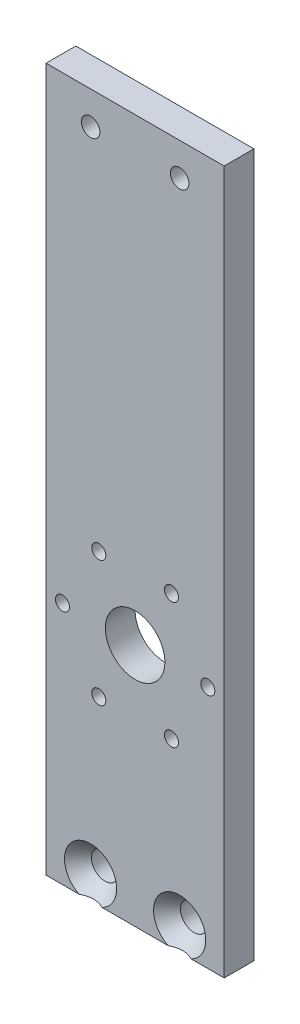
ISO-10303-21;
HEADER;
FILE_DESCRIPTION(('STEP AP214'),'2;1');
FILE_NAME('part.step','',(''),(''),'','','');
FILE_SCHEMA(('AUTOMOTIVE_DESIGN { 1 0 10303 214 1 1 1 1 }'));
ENDSEC;
DATA;
#1=APPLICATION_CONTEXT('core data for automotive mechanical design processes');
#2=APPLICATION_PROTOCOL_DEFINITION('international standard','automotive_design',2000,#1);
#3=PRODUCT_CONTEXT('',#1,'mechanical');
#4=PRODUCT('Part','Part','',(#3));
#5=PRODUCT_RELATED_PRODUCT_CATEGORY('part','',(#4));
#6=PRODUCT_DEFINITION_FORMATION('','',#4);
#7=PRODUCT_DEFINITION_CONTEXT('part definition',#1,'design');
#8=PRODUCT_DEFINITION('design','',#6,#7);
#9=PRODUCT_DEFINITION_SHAPE('','',#8);
#10=(LENGTH_UNIT() NAMED_UNIT(*) SI_UNIT(.MILLI.,.METRE.));
#11=(NAMED_UNIT(*) PLANE_ANGLE_UNIT() SI_UNIT($,.RADIAN.));
#12=(NAMED_UNIT(*) SI_UNIT($,.STERADIAN.) SOLID_ANGLE_UNIT());
#13=UNCERTAINTY_MEASURE_WITH_UNIT(LENGTH_MEASURE(1.E-05),#10,'distance_accuracy_value','');
#14=(GEOMETRIC_REPRESENTATION_CONTEXT(3) GLOBAL_UNCERTAINTY_ASSIGNED_CONTEXT((#13)) GLOBAL_UNIT_ASSIGNED_CONTEXT((#10,
#11,#12)) REPRESENTATION_CONTEXT('',''));
#15=CARTESIAN_POINT('',(0.,0.,0.));
#16=DIRECTION('',(0.,0.,1.));
#17=DIRECTION('',(1.,0.,0.));
#18=AXIS2_PLACEMENT_3D('',#15,#16,#17);
#19=CARTESIAN_POINT('',(0.,0.,3.175));
#20=DIRECTION('',(0.,0.,-1.));
#21=DIRECTION('',(-1.,0.,0.));
#22=AXIS2_PLACEMENT_3D('',#19,#20,#21);
#23=PLANE('',#22);
#24=CARTESIAN_POINT('',(-9.5,68.,3.175));
#25=DIRECTION('',(0.,0.,1.));
#26=DIRECTION('',(1.,0.,0.));
#27=AXIS2_PLACEMENT_3D('',#24,#25,#26);
#28=CIRCLE('',#27,1.984375);
#29=CARTESIAN_POINT('',(-7.515625,68.,3.175));
#30=VERTEX_POINT('',#29);
#31=EDGE_CURVE('E318',#30,#30,#28,.T.);
#32=ORIENTED_EDGE('',*,*,#31,.F.);
#33=EDGE_LOOP('',(#32));
#34=FACE_BOUND('',#33,.T.);
#35=CARTESIAN_POINT('',(-7.75000000000014,-36.4233937586587,3.175));
#36=DIRECTION('',(0.,0.,1.));
#37=DIRECTION('',(1.,0.,0.));
#38=AXIS2_PLACEMENT_3D('',#35,#36,#37);
#39=CIRCLE('',#38,1.5);
#40=CARTESIAN_POINT('',(-6.25000000000014,-36.4233937586587,3.175));
#41=VERTEX_POINT('',#40);
#42=EDGE_CURVE('E239',#41,#41,#39,.T.);
#43=ORIENTED_EDGE('',*,*,#42,.F.);
#44=EDGE_LOOP('',(#43));
#45=FACE_BOUND('',#44,.T.);
#46=CARTESIAN_POINT('',(7.74999999999989,-36.4233937586589,3.175));
#47=DIRECTION('',(0.,0.,1.));
#48=DIRECTION('',(1.,0.,0.));
#49=AXIS2_PLACEMENT_3D('',#46,#47,#48);
#50=CIRCLE('',#49,1.5);
#51=CARTESIAN_POINT('',(9.24999999999989,-36.4233937586589,3.175));
#52=VERTEX_POINT('',#51);
#53=EDGE_CURVE('E255',#52,#52,#50,.T.);
#54=ORIENTED_EDGE('',*,*,#53,.F.);
#55=EDGE_LOOP('',(#54));
#56=FACE_BOUND('',#55,.T.);
#57=CARTESIAN_POINT('',(15.5,-23.0000000000001,3.175));
#58=DIRECTION('',(0.,0.,1.));
#59=DIRECTION('',(1.,0.,0.));
#60=AXIS2_PLACEMENT_3D('',#57,#58,#59);
#61=CIRCLE('',#60,1.5);
#62=CARTESIAN_POINT('',(17.,-23.0000000000001,3.175));
#63=VERTEX_POINT('',#62);
#64=EDGE_CURVE('E252',#63,#63,#61,.T.);
#65=ORIENTED_EDGE('',*,*,#64,.F.);
#66=EDGE_LOOP('',(#65));
#67=FACE_BOUND('',#66,.T.);
#68=CARTESIAN_POINT('',(7.75000000000008,-9.57660624134124,3.175));
#69=DIRECTION('',(0.,0.,1.));
#70=DIRECTION('',(1.,0.,0.));
#71=AXIS2_PLACEMENT_3D('',#68,#69,#70);
#72=CIRCLE('',#71,1.5);
#73=CARTESIAN_POINT('',(9.25000000000008,-9.57660624134124,3.175));
#74=VERTEX_POINT('',#73);
#75=EDGE_CURVE('E249',#74,#74,#72,.T.);
#76=ORIENTED_EDGE('',*,*,#75,.F.);
#77=EDGE_LOOP('',(#76));
#78=FACE_BOUND('',#77,.T.);
#79=CARTESIAN_POINT('',(-7.74999999999995,-9.57660624134119,3.175));
#80=DIRECTION('',(0.,0.,1.));
#81=DIRECTION('',(1.,0.,0.));
#82=AXIS2_PLACEMENT_3D('',#79,#80,#81);
#83=CIRCLE('',#82,1.5);
#84=CARTESIAN_POINT('',(-6.24999999999995,-9.57660624134119,3.175));
#85=VERTEX_POINT('',#84);
#86=EDGE_CURVE('E246',#85,#85,#83,.T.);
#87=ORIENTED_EDGE('',*,*,#86,.F.);
#88=EDGE_LOOP('',(#87));
#89=FACE_BOUND('',#88,.T.);
#90=CARTESIAN_POINT('',(-15.5,-23.,3.175));
#91=DIRECTION('',(0.,0.,1.));
#92=DIRECTION('',(1.,0.,0.));
#93=AXIS2_PLACEMENT_3D('',#90,#91,#92);
#94=CIRCLE('',#93,1.5);
#95=CARTESIAN_POINT('',(-14.,-23.,3.175));
#96=VERTEX_POINT('',#95);
#97=EDGE_CURVE('E243',#96,#96,#94,.T.);
#98=ORIENTED_EDGE('',*,*,#97,.F.);
#99=EDGE_LOOP('',(#98));
#100=FACE_BOUND('',#99,.T.);
#101=CARTESIAN_POINT('',(0.,-23.,3.175));
#102=DIRECTION('',(0.,0.,1.));
#103=DIRECTION('',(1.,0.,0.));
#104=AXIS2_PLACEMENT_3D('',#101,#102,#103);
#105=CIRCLE('',#104,6.35);
#106=CARTESIAN_POINT('',(6.35000000000001,-23.,3.175));
#107=VERTEX_POINT('',#106);
#108=EDGE_CURVE('E128',#107,#107,#105,.T.);
#109=ORIENTED_EDGE('',*,*,#108,.F.);
#110=EDGE_LOOP('',(#109));
#111=FACE_BOUND('',#110,.T.);
#112=CARTESIAN_POINT('',(-9.49999999999998,-70.,3.175));
#113=DIRECTION('',(0.,0.,1.));
#114=DIRECTION('',(1.,0.,0.));
#115=AXIS2_PLACEMENT_3D('',#112,#113,#114);
#116=CIRCLE('',#115,5.5626);
#117=CARTESIAN_POINT('',(-7.06227180350228,-75.,3.175));
#118=VERTEX_POINT('',#117);
#119=CARTESIAN_POINT('',(-11.9377281964977,-75.,3.175));
#120=VERTEX_POINT('',#119);
#121=EDGE_CURVE('E48',#118,#120,#116,.T.);
#122=ORIENTED_EDGE('',*,*,#121,.F.);
#123=DIRECTION('',(1.,0.,0.));
#124=VECTOR('',#123,1.);
#125=CARTESIAN_POINT('',(-19.,-75.,3.175));
#126=LINE('',#125,#124);
#127=CARTESIAN_POINT('',(7.06227180350231,-75.,3.175));
#128=VERTEX_POINT('',#127);
#129=EDGE_CURVE('E54',#118,#128,#126,.T.);
#130=ORIENTED_EDGE('',*,*,#129,.T.);
#131=CARTESIAN_POINT('',(9.50000000000002,-70.,3.175));
#132=DIRECTION('',(0.,0.,1.));
#133=DIRECTION('',(1.,0.,0.));
#134=AXIS2_PLACEMENT_3D('',#131,#132,#133);
#135=CIRCLE('',#134,5.5626);
#136=CARTESIAN_POINT('',(11.9377281964977,-75.,3.175));
#137=VERTEX_POINT('',#136);
#138=EDGE_CURVE('E237',#137,#128,#135,.T.);
#139=ORIENTED_EDGE('',*,*,#138,.F.);
#140=CARTESIAN_POINT('',(19.,-75.,3.175));
#141=VERTEX_POINT('',#140);
#142=EDGE_CURVE('E95',#137,#141,#126,.T.);
#143=ORIENTED_EDGE('',*,*,#142,.T.);
#144=DIRECTION('',(0.,1.,0.));
#145=VECTOR('',#144,1.);
#146=CARTESIAN_POINT('',(19.,-75.,3.175));
#147=LINE('',#146,#145);
#148=CARTESIAN_POINT('',(19.,75.,3.175));
#149=VERTEX_POINT('',#148);
#150=EDGE_CURVE('E112',#141,#149,#147,.T.);
#151=ORIENTED_EDGE('',*,*,#150,.T.);
#152=DIRECTION('',(-1.,0.,0.));
#153=VECTOR('',#152,1.);
#154=CARTESIAN_POINT('',(-19.,75.,3.175));
#155=LINE('',#154,#153);
#156=CARTESIAN_POINT('',(-19.,75.,3.175));
#157=VERTEX_POINT('',#156);
#158=EDGE_CURVE('E263',#149,#157,#155,.T.);
#159=ORIENTED_EDGE('',*,*,#158,.T.);
#160=DIRECTION('',(0.,-1.,0.));
#161=VECTOR('',#160,1.);
#162=CARTESIAN_POINT('',(-19.,-75.,3.175));
#163=LINE('',#162,#161);
#164=CARTESIAN_POINT('',(-19.,-75.,3.175));
#165=VERTEX_POINT('',#164);
#166=EDGE_CURVE('E98',#157,#165,#163,.T.);
#167=ORIENTED_EDGE('',*,*,#166,.T.);
#168=EDGE_CURVE('E89',#165,#120,#126,.T.);
#169=ORIENTED_EDGE('',*,*,#168,.T.);
#170=EDGE_LOOP('',(#122,#130,#139,#143,#151,#159,#167,#169));
#171=FACE_BOUND('',#170,.T.);
#172=CARTESIAN_POINT('',(9.5,68.,3.175));
#173=DIRECTION('',(0.,0.,1.));
#174=DIRECTION('',(1.,0.,0.));
#175=AXIS2_PLACEMENT_3D('',#172,#173,#174);
#176=CIRCLE('',#175,1.984375);
#177=CARTESIAN_POINT('',(11.484375,68.,3.175));
#178=VERTEX_POINT('',#177);
#179=EDGE_CURVE('E316',#178,#178,#176,.F.);
#180=ORIENTED_EDGE('',*,*,#179,.T.);
#181=EDGE_LOOP('',(#180));
#182=FACE_BOUND('',#181,.T.);
#183=ADVANCED_FACE('F32',(#34,#45,#56,#67,#78,#89,#100,#111,#171,#182),#23,.F.);
#184=CARTESIAN_POINT('',(0.,0.,-3.175));
#185=DIRECTION('',(0.,0.,-1.));
#186=DIRECTION('',(-1.,0.,0.));
#187=AXIS2_PLACEMENT_3D('',#184,#185,#186);
#188=PLANE('',#187);
#189=DIRECTION('',(0.,1.,0.));
#190=VECTOR('',#189,1.);
#191=CARTESIAN_POINT('',(19.,-75.,-3.175));
#192=LINE('',#191,#190);
#193=CARTESIAN_POINT('',(19.,-75.,-3.175));
#194=VERTEX_POINT('',#193);
#195=CARTESIAN_POINT('',(19.,75.,-3.175));
#196=VERTEX_POINT('',#195);
#197=EDGE_CURVE('E102',#194,#196,#192,.T.);
#198=ORIENTED_EDGE('',*,*,#197,.F.);
#199=DIRECTION('',(1.,0.,0.));
#200=VECTOR('',#199,1.);
#201=CARTESIAN_POINT('',(-19.,-75.,-3.175));
#202=LINE('',#201,#200);
#203=CARTESIAN_POINT('',(-19.,-75.,-3.175));
#204=VERTEX_POINT('',#203);
#205=EDGE_CURVE('E110',#204,#194,#202,.T.);
#206=ORIENTED_EDGE('',*,*,#205,.F.);
#207=DIRECTION('',(0.,-1.,0.));
#208=VECTOR('',#207,1.);
#209=CARTESIAN_POINT('',(-19.,-75.,-3.175));
#210=LINE('',#209,#208);
#211=CARTESIAN_POINT('',(-19.,75.,-3.175));
#212=VERTEX_POINT('',#211);
#213=EDGE_CURVE('E108',#212,#204,#210,.T.);
#214=ORIENTED_EDGE('',*,*,#213,.F.);
#215=DIRECTION('',(-1.,0.,0.));
#216=VECTOR('',#215,1.);
#217=CARTESIAN_POINT('',(-19.,75.,-3.175));
#218=LINE('',#217,#216);
#219=EDGE_CURVE('E105',#196,#212,#218,.T.);
#220=ORIENTED_EDGE('',*,*,#219,.F.);
#221=EDGE_LOOP('',(#198,#206,#214,#220));
#222=FACE_BOUND('',#221,.T.);
#223=CARTESIAN_POINT('',(0.,-23.,-3.175));
#224=DIRECTION('',(0.,0.,-1.));
#225=DIRECTION('',(-1.,0.,0.));
#226=AXIS2_PLACEMENT_3D('',#223,#224,#225);
#227=CIRCLE('',#226,6.35);
#228=CARTESIAN_POINT('',(-6.34999999999999,-23.,-3.175));
#229=VERTEX_POINT('',#228);
#230=EDGE_CURVE('E124',#229,#229,#227,.T.);
#231=ORIENTED_EDGE('',*,*,#230,.F.);
#232=EDGE_LOOP('',(#231));
#233=FACE_BOUND('',#232,.T.);
#234=CARTESIAN_POINT('',(-15.5,-23.,-3.175));
#235=DIRECTION('',(0.,0.,-1.));
#236=DIRECTION('',(-1.,0.,0.));
#237=AXIS2_PLACEMENT_3D('',#234,#235,#236);
#238=CIRCLE('',#237,1.5);
#239=CARTESIAN_POINT('',(-17.,-23.,-3.175));
#240=VERTEX_POINT('',#239);
#241=EDGE_CURVE('E127',#240,#240,#238,.T.);
#242=ORIENTED_EDGE('',*,*,#241,.F.);
#243=EDGE_LOOP('',(#242));
#244=FACE_BOUND('',#243,.T.);
#245=CARTESIAN_POINT('',(-7.74999999999995,-9.57660624134119,-3.175));
#246=DIRECTION('',(0.,0.,-1.));
#247=DIRECTION('',(-1.,0.,0.));
#248=AXIS2_PLACEMENT_3D('',#245,#246,#247);
#249=CIRCLE('',#248,1.5);
#250=CARTESIAN_POINT('',(-9.24999999999996,-9.57660624134119,-3.175));
#251=VERTEX_POINT('',#250);
#252=EDGE_CURVE('E131',#251,#251,#249,.T.);
#253=ORIENTED_EDGE('',*,*,#252,.F.);
#254=EDGE_LOOP('',(#253));
#255=FACE_BOUND('',#254,.T.);
#256=CARTESIAN_POINT('',(7.75000000000008,-9.57660624134124,-3.175));
#257=DIRECTION('',(0.,0.,-1.));
#258=DIRECTION('',(-1.,0.,0.));
#259=AXIS2_PLACEMENT_3D('',#256,#257,#258);
#260=CIRCLE('',#259,1.5);
#261=CARTESIAN_POINT('',(6.25000000000008,-9.57660624134124,-3.175));
#262=VERTEX_POINT('',#261);
#263=EDGE_CURVE('E134',#262,#262,#260,.T.);
#264=ORIENTED_EDGE('',*,*,#263,.F.);
#265=EDGE_LOOP('',(#264));
#266=FACE_BOUND('',#265,.T.);
#267=CARTESIAN_POINT('',(15.5,-23.0000000000001,-3.175));
#268=DIRECTION('',(0.,0.,-1.));
#269=DIRECTION('',(-1.,0.,0.));
#270=AXIS2_PLACEMENT_3D('',#267,#268,#269);
#271=CIRCLE('',#270,1.5);
#272=CARTESIAN_POINT('',(14.,-23.0000000000001,-3.175));
#273=VERTEX_POINT('',#272);
#274=EDGE_CURVE('E137',#273,#273,#271,.T.);
#275=ORIENTED_EDGE('',*,*,#274,.F.);
#276=EDGE_LOOP('',(#275));
#277=FACE_BOUND('',#276,.T.);
#278=CARTESIAN_POINT('',(7.74999999999989,-36.4233937586589,-3.175));
#279=DIRECTION('',(0.,0.,-1.));
#280=DIRECTION('',(-1.,0.,0.));
#281=AXIS2_PLACEMENT_3D('',#278,#279,#280);
#282=CIRCLE('',#281,1.5);
#283=CARTESIAN_POINT('',(6.24999999999989,-36.4233937586589,-3.175));
#284=VERTEX_POINT('',#283);
#285=EDGE_CURVE('E140',#284,#284,#282,.T.);
#286=ORIENTED_EDGE('',*,*,#285,.F.);
#287=EDGE_LOOP('',(#286));
#288=FACE_BOUND('',#287,.T.);
#289=CARTESIAN_POINT('',(-7.75000000000014,-36.4233937586587,-3.175));
#290=DIRECTION('',(0.,0.,-1.));
#291=DIRECTION('',(-1.,0.,0.));
#292=AXIS2_PLACEMENT_3D('',#289,#290,#291);
#293=CIRCLE('',#292,1.5);
#294=CARTESIAN_POINT('',(-9.25000000000014,-36.4233937586587,-3.175));
#295=VERTEX_POINT('',#294);
#296=EDGE_CURVE('E106',#295,#295,#293,.T.);
#297=ORIENTED_EDGE('',*,*,#296,.F.);
#298=EDGE_LOOP('',(#297));
#299=FACE_BOUND('',#298,.T.);
#300=CARTESIAN_POINT('',(9.50000000000002,-70.,-3.175));
#301=DIRECTION('',(0.,0.,-1.));
#302=DIRECTION('',(-1.,0.,0.));
#303=AXIS2_PLACEMENT_3D('',#300,#301,#302);
#304=CIRCLE('',#303,2.8956);
#305=CARTESIAN_POINT('',(6.60440000000002,-70.,-3.175));
#306=VERTEX_POINT('',#305);
#307=EDGE_CURVE('E152',#306,#306,#304,.T.);
#308=ORIENTED_EDGE('',*,*,#307,.F.);
#309=EDGE_LOOP('',(#308));
#310=FACE_BOUND('',#309,.T.);
#311=CARTESIAN_POINT('',(-9.49999999999998,-70.,-3.175));
#312=DIRECTION('',(0.,0.,-1.));
#313=DIRECTION('',(-1.,0.,0.));
#314=AXIS2_PLACEMENT_3D('',#311,#312,#313);
#315=CIRCLE('',#314,2.8956);
#316=CARTESIAN_POINT('',(-12.3956,-70.,-3.175));
#317=VERTEX_POINT('',#316);
#318=EDGE_CURVE('E172',#317,#317,#315,.T.);
#319=ORIENTED_EDGE('',*,*,#318,.F.);
#320=EDGE_LOOP('',(#319));
#321=FACE_BOUND('',#320,.T.);
#322=CARTESIAN_POINT('',(-9.5,68.,-3.175));
#323=DIRECTION('',(0.,0.,-1.));
#324=DIRECTION('',(-1.,0.,0.));
#325=AXIS2_PLACEMENT_3D('',#322,#323,#324);
#326=CIRCLE('',#325,1.984375);
#327=CARTESIAN_POINT('',(-11.484375,68.,-3.175));
#328=VERTEX_POINT('',#327);
#329=EDGE_CURVE('E317',#328,#328,#326,.T.);
#330=ORIENTED_EDGE('',*,*,#329,.F.);
#331=EDGE_LOOP('',(#330));
#332=FACE_BOUND('',#331,.T.);
#333=CARTESIAN_POINT('',(9.5,68.,-3.175));
#334=DIRECTION('',(0.,0.,-1.));
#335=DIRECTION('',(-1.,0.,0.));
#336=AXIS2_PLACEMENT_3D('',#333,#334,#335);
#337=CIRCLE('',#336,1.984375);
#338=CARTESIAN_POINT('',(7.515625,68.,-3.175));
#339=VERTEX_POINT('',#338);
#340=EDGE_CURVE('E36',#339,#339,#337,.F.);
#341=ORIENTED_EDGE('',*,*,#340,.T.);
#342=EDGE_LOOP('',(#341));
#343=FACE_BOUND('',#342,.T.);
#344=ADVANCED_FACE('F163',(#222,#233,#244,#255,#266,#277,#288,#299,#310,#321,#332,#343),#188,.T.);
#345=CARTESIAN_POINT('',(19.,-75.,3.175));
#346=DIRECTION('',(-1.,0.,0.));
#347=DIRECTION('',(0.,0.,1.));
#348=AXIS2_PLACEMENT_3D('',#345,#346,#347);
#349=PLANE('',#348);
#350=ORIENTED_EDGE('',*,*,#197,.T.);
#351=DIRECTION('',(0.,0.,-1.));
#352=VECTOR('',#351,1.);
#353=CARTESIAN_POINT('',(19.,75.,3.175));
#354=LINE('',#353,#352);
#355=EDGE_CURVE('E121',#149,#196,#354,.T.);
#356=ORIENTED_EDGE('',*,*,#355,.F.);
#357=ORIENTED_EDGE('',*,*,#150,.F.);
#358=DIRECTION('',(0.,0.,-1.));
#359=VECTOR('',#358,1.);
#360=CARTESIAN_POINT('',(19.,-75.,3.175));
#361=LINE('',#360,#359);
#362=EDGE_CURVE('E97',#141,#194,#361,.T.);
#363=ORIENTED_EDGE('',*,*,#362,.T.);
#364=EDGE_LOOP('',(#350,#356,#357,#363));
#365=FACE_BOUND('',#364,.T.);
#366=ADVANCED_FACE('F34',(#365),#349,.F.);
#367=CARTESIAN_POINT('',(-19.,75.,3.175));
#368=DIRECTION('',(0.,-1.,0.));
#369=DIRECTION('',(0.,0.,-1.));
#370=AXIS2_PLACEMENT_3D('',#367,#368,#369);
#371=PLANE('',#370);
#372=ORIENTED_EDGE('',*,*,#219,.T.);
#373=DIRECTION('',(0.,0.,-1.));
#374=VECTOR('',#373,1.);
#375=CARTESIAN_POINT('',(-19.,75.,3.175));
#376=LINE('',#375,#374);
#377=EDGE_CURVE('E118',#157,#212,#376,.T.);
#378=ORIENTED_EDGE('',*,*,#377,.F.);
#379=ORIENTED_EDGE('',*,*,#158,.F.);
#380=ORIENTED_EDGE('',*,*,#355,.T.);
#381=EDGE_LOOP('',(#372,#378,#379,#380));
#382=FACE_BOUND('',#381,.T.);
#383=ADVANCED_FACE('F278',(#382),#371,.F.);
#384=CARTESIAN_POINT('',(-19.,-75.,3.175));
#385=DIRECTION('',(1.,0.,0.));
#386=DIRECTION('',(0.,0.,-1.));
#387=AXIS2_PLACEMENT_3D('',#384,#385,#386);
#388=PLANE('',#387);
#389=ORIENTED_EDGE('',*,*,#213,.T.);
#390=DIRECTION('',(0.,0.,-1.));
#391=VECTOR('',#390,1.);
#392=CARTESIAN_POINT('',(-19.,-75.,3.175));
#393=LINE('',#392,#391);
#394=EDGE_CURVE('E115',#165,#204,#393,.T.);
#395=ORIENTED_EDGE('',*,*,#394,.F.);
#396=ORIENTED_EDGE('',*,*,#166,.F.);
#397=ORIENTED_EDGE('',*,*,#377,.T.);
#398=EDGE_LOOP('',(#389,#395,#396,#397));
#399=FACE_BOUND('',#398,.T.);
#400=ADVANCED_FACE('F162',(#399),#388,.F.);
#401=CARTESIAN_POINT('',(-19.,-75.,3.175));
#402=DIRECTION('',(0.,1.,0.));
#403=DIRECTION('',(0.,0.,1.));
#404=AXIS2_PLACEMENT_3D('',#401,#402,#403);
#405=PLANE('',#404);
#406=ORIENTED_EDGE('',*,*,#129,.F.);
#407=CARTESIAN_POINT('',(-26.0196585722648,-75.,16.6310367893635));
#408=CARTESIAN_POINT('',(-25.6187917750997,-75.,16.1897063110865));
#409=CARTESIAN_POINT('',(-25.217290981288,-75.,15.7489489785061));
#410=CARTESIAN_POINT('',(-24.4125950547089,-75.,14.8689406966457));
#411=CARTESIAN_POINT('',(-24.0093998320183,-75.,14.429689829619));
#412=CARTESIAN_POINT('',(-23.1997718673474,-75.,13.5518445301664));
#413=CARTESIAN_POINT('',(-22.793333155462,-75.,13.1132555973765));
#414=CARTESIAN_POINT('',(-21.9777776712772,-75.,12.2386056376471));
#415=CARTESIAN_POINT('',(-21.5686610038983,-75.,11.8025445129169));
#416=CARTESIAN_POINT('',(-20.6980078436307,-75.,10.8820442263586));
#417=CARTESIAN_POINT('',(-20.2360273159944,-75.,10.3980236615251));
#418=CARTESIAN_POINT('',(-19.5383790904854,-75.,9.6764486566446));
#419=CARTESIAN_POINT('',(-19.3050334001411,-75.,9.43664945223078));
#420=CARTESIAN_POINT('',(-18.8364677872479,-75.,8.95889045340858));
#421=CARTESIAN_POINT('',(-18.6012478786037,-75.,8.72093064537981));
#422=CARTESIAN_POINT('',(-18.1289320043782,-75.,8.24767933023866));
#423=CARTESIAN_POINT('',(-17.8918398802972,-75.,8.01238399392632));
#424=CARTESIAN_POINT('',(-17.4148696309615,-75.,7.54463800648936));
#425=CARTESIAN_POINT('',(-17.1749915605182,-75.,7.31218729958305));
#426=CARTESIAN_POINT('',(-16.6918076696093,-75.,6.85097571033452));
#427=CARTESIAN_POINT('',(-16.4485026093336,-75.,6.62221403309291));
#428=CARTESIAN_POINT('',(-15.9575039079211,-75.,6.16946028542685));
#429=CARTESIAN_POINT('',(-15.7098105695023,-75.,5.9454678883307));
#430=CARTESIAN_POINT('',(-15.3018311604176,-75.,5.58593898172003));
#431=CARTESIAN_POINT('',(-15.1432607305823,-75.,5.44845700420455));
#432=CARTESIAN_POINT('',(-14.8234552448771,-75.,5.17660816092634));
#433=CARTESIAN_POINT('',(-14.6622201012966,-75.,5.04224139805395));
#434=CARTESIAN_POINT('',(-14.3362753857389,-75.,4.77712225256447));
#435=CARTESIAN_POINT('',(-14.1715596838667,-75.,4.64637738221847));
#436=CARTESIAN_POINT('',(-13.838346955584,-75.,4.38979410981921));
#437=CARTESIAN_POINT('',(-13.6698501305131,-75.,4.26395544748912));
#438=CARTESIAN_POINT('',(-13.3316421942389,-75.,4.02094180935433));
#439=CARTESIAN_POINT('',(-13.1620184134616,-75.,3.90364594458456));
#440=CARTESIAN_POINT('',(-12.8175353577679,-75.,3.67683639229568));
#441=CARTESIAN_POINT('',(-12.6426746396574,-75.,3.56732487856276));
#442=CARTESIAN_POINT('',(-12.2874451466327,-75.,3.35890055845882));
#443=CARTESIAN_POINT('',(-12.1070957680074,-75.,3.25995498759554));
#444=CARTESIAN_POINT('',(-11.739658212254,-75.,3.0756096518651));
#445=CARTESIAN_POINT('',(-11.5525758328782,-75.,2.99019855951438));
#446=CARTESIAN_POINT('',(-11.2351667530232,-75.,2.86278099285603));
#447=CARTESIAN_POINT('',(-11.1068326989442,-75.,2.81582134393902));
#448=CARTESIAN_POINT('',(-10.8470918900173,-75.,2.73117575789262));
#449=CARTESIAN_POINT('',(-10.71568488291,-75.,2.69349058505419));
#450=CARTESIAN_POINT('',(-10.4507859634935,-75.,2.62898750889812));
#451=CARTESIAN_POINT('',(-10.3173051970033,-75.,2.60212439247495));
#452=CARTESIAN_POINT('',(-10.0484997821762,-75.,2.56028150487514));
#453=CARTESIAN_POINT('',(-9.91317554320713,-75.,2.54529913780205));
#454=CARTESIAN_POINT('',(-9.63237027191908,-75.,2.52740743647533));
#455=CARTESIAN_POINT('',(-9.48683012906343,-75.,2.5253981859898));
#456=CARTESIAN_POINT('',(-9.19629021851148,-75.,2.53598141373028));
#457=CARTESIAN_POINT('',(-9.05129046879455,-75.,2.54857437350968));
#458=CARTESIAN_POINT('',(-8.76262236016367,-75.,2.58766554224584));
#459=CARTESIAN_POINT('',(-8.61896153384905,-75.,2.61421854312751));
#460=CARTESIAN_POINT('',(-8.33453692190763,-75.,2.67981294890654));
#461=CARTESIAN_POINT('',(-8.1937738202087,-75.,2.71885726686712));
#462=CARTESIAN_POINT('',(-7.85752415461905,-75.,2.82626652345148));
#463=CARTESIAN_POINT('',(-7.66377942328898,-75.,2.90006436191173));
#464=CARTESIAN_POINT('',(-7.28353814959474,-75.,3.06433932931765));
#465=CARTESIAN_POINT('',(-7.09704614036378,-75.,3.15482669302913));
#466=CARTESIAN_POINT('',(-6.72897282247384,-75.,3.34934783337401));
#467=CARTESIAN_POINT('',(-6.5474582978447,-75.,3.45350670049429));
#468=CARTESIAN_POINT('',(-6.27971844819698,-75.,3.61697995540621));
#469=CARTESIAN_POINT('',(-6.19123996956942,-75.,3.67266805107579));
#470=CARTESIAN_POINT('',(-6.01565843486318,-75.,3.78616684552813));
#471=CARTESIAN_POINT('',(-5.9285553223738,-75.,3.84397745693073));
#472=CARTESIAN_POINT('',(-5.64383351518841,-75.,4.03736056377651));
#473=CARTESIAN_POINT('',(-5.44888218911779,-75.,4.1768655980156));
#474=CARTESIAN_POINT('',(-5.0643417801212,-75.,4.46310852614649));
#475=CARTESIAN_POINT('',(-4.87475409591164,-75.,4.60984827981993));
#476=CARTESIAN_POINT('',(-4.49981055899002,-75.,4.90896306335746));
#477=CARTESIAN_POINT('',(-4.31445871521441,-75.,5.06134310094799));
#478=CARTESIAN_POINT('',(-3.94738695866079,-75.,5.37036628027693));
#479=CARTESIAN_POINT('',(-3.76566671495779,-75.,5.52700903048056));
#480=CARTESIAN_POINT('',(-3.40445251858069,-75.,5.84434099727339));
#481=CARTESIAN_POINT('',(-3.22497105757801,-75.,6.00504439897362));
#482=CARTESIAN_POINT('',(-2.86850829244934,-75.,6.32920078248979));
#483=CARTESIAN_POINT('',(-2.69152703636554,-75.,6.49265381700888));
#484=CARTESIAN_POINT('',(-2.16388709454752,-75.,6.98617941955953));
#485=CARTESIAN_POINT('',(-1.81634588035704,-75.,7.31958416308448));
#486=CARTESIAN_POINT('',(-1.16302339541538,-75.,7.95756174474148));
#487=CARTESIAN_POINT('',(-0.85665238247317,-75.,8.26153458299604));
#488=CARTESIAN_POINT('',(-0.24756040130192,-75.,8.87319729292583));
#489=CARTESIAN_POINT('',(0.0551600489251962,-75.,9.18088767999106));
#490=CARTESIAN_POINT('',(0.655130939901568,-75.,9.79640250525315));
#491=CARTESIAN_POINT('',(0.952406036843112,-75.,10.1042029644136));
#492=CARTESIAN_POINT('',(1.54461692816667,-75.,10.7219319446204));
#493=CARTESIAN_POINT('',(1.83955316868381,-75.,11.0318600377012));
#494=CARTESIAN_POINT('',(2.13362121559879,-75.,11.342602237988));
#495=B_SPLINE_CURVE_WITH_KNOTS('',3,(#407,#408,#409,#410,#411,#412,#413,#414,#415,#416,#417,
#418,#419,#420,#421,#422,#423,#424,#425,#426,#427,#428,#429,#430,#431,#432,#433,#434,#435,#436,
#437,#438,#439,#440,#441,#442,#443,#444,#445,#446,#447,#448,#449,#450,#451,#452,#453,#454,#455,
#456,#457,#458,#459,#460,#461,#462,#463,#464,#465,#466,#467,#468,#469,#470,#471,#472,#473,#474,
#475,#476,#477,#478,#479,#480,#481,#482,#483,#484,#485,#486,#487,#488,#489,#490,#491,#492,#493,
#494),.UNSPECIFIED.,.F.,.F.,(4,2,2,2,2,2,2,2,2,2,2,2,2,2,2,2,2,2,2,2,2,2,2,2,2,2,2,2,2,2,2,2,2,
2,2,2,2,2,2,2,2,2,2,4),(0.,1.78863338006737,3.57736291257507,5.37122474954505,7.16501671985619,
9.17228682803492,10.176064222976,11.1798341779944,12.1819080803352,13.1839623009381,
14.1857976367994,15.1875641297875,15.8171461133098,16.4467488613388,17.0775722273511,
17.7083620822005,18.3268855274227,18.9455810227221,19.5622985659562,20.1784971988411,
20.5881751887829,20.9978869281702,21.4058687386587,21.8137613821639,22.2496749307726,
22.6856028553981,23.1232546742623,23.5610086311057,24.1818934584528,24.8031603139062,
25.4305697664779,25.7441812746443,26.0577798864346,26.776699533139,27.4958049612831,
28.2155649281198,28.9352590058917,29.657963457968,30.3806817781848,31.8253706083484,
33.12008277183,34.4149765383814,35.6987176657559,36.9822077273845),.UNSPECIFIED.);
#496=EDGE_CURVE('E11',#118,#120,#495,.F.);
#497=ORIENTED_EDGE('',*,*,#496,.T.);
#498=ORIENTED_EDGE('',*,*,#168,.F.);
#499=ORIENTED_EDGE('',*,*,#394,.T.);
#500=ORIENTED_EDGE('',*,*,#205,.T.);
#501=ORIENTED_EDGE('',*,*,#362,.F.);
#502=ORIENTED_EDGE('',*,*,#142,.F.);
#503=CARTESIAN_POINT('',(-7.01965857226476,-75.,16.6310367893635));
#504=CARTESIAN_POINT('',(-6.61879177509973,-75.,16.1897063110865));
#505=CARTESIAN_POINT('',(-6.21729098128802,-75.,15.7489489785061));
#506=CARTESIAN_POINT('',(-5.41259505470886,-75.,14.8689406966457));
#507=CARTESIAN_POINT('',(-5.00939983201829,-75.,14.429689829619));
#508=CARTESIAN_POINT('',(-4.19977186734739,-75.,13.5518445301664));
#509=CARTESIAN_POINT('',(-3.79333315546204,-75.,13.1132555973765));
#510=CARTESIAN_POINT('',(-2.97777767127718,-75.,12.2386056376471));
#511=CARTESIAN_POINT('',(-2.56866100389831,-75.,11.8025445129169));
#512=CARTESIAN_POINT('',(-1.69800784363066,-75.,10.8820442263586));
#513=CARTESIAN_POINT('',(-1.23602731599445,-75.,10.3980236615251));
#514=CARTESIAN_POINT('',(-0.538379090485443,-75.,9.67644865664461));
#515=CARTESIAN_POINT('',(-0.305033400141069,-75.,9.43664945223079));
#516=CARTESIAN_POINT('',(0.163532212752065,-75.,8.95889045340859));
#517=CARTESIAN_POINT('',(0.398752121396337,-75.,8.72093064537981));
#518=CARTESIAN_POINT('',(0.871067995621756,-75.,8.24767933023867));
#519=CARTESIAN_POINT('',(1.10816011970275,-75.,8.01238399392633));
#520=CARTESIAN_POINT('',(1.58513036903845,-75.,7.54463800648937));
#521=CARTESIAN_POINT('',(1.82500843948183,-75.,7.31218729958306));
#522=CARTESIAN_POINT('',(2.30819233039065,-75.,6.85097571033453));
#523=CARTESIAN_POINT('',(2.55149739066639,-75.,6.62221403309292));
#524=CARTESIAN_POINT('',(3.04249609207888,-75.,6.16946028542686));
#525=CARTESIAN_POINT('',(3.29018943049772,-75.,5.94546788833071));
#526=CARTESIAN_POINT('',(3.6981688395824,-75.,5.58593898172004));
#527=CARTESIAN_POINT('',(3.85673926941772,-75.,5.44845700420456));
#528=CARTESIAN_POINT('',(4.17654475512289,-75.,5.17660816092635));
#529=CARTESIAN_POINT('',(4.33777989870339,-75.,5.04224139805396));
#530=CARTESIAN_POINT('',(4.66372461426106,-75.,4.77712225256448));
#531=CARTESIAN_POINT('',(4.82844031613326,-75.,4.64637738221848));
#532=CARTESIAN_POINT('',(5.16165304441603,-75.,4.38979410981921));
#533=CARTESIAN_POINT('',(5.33014986948686,-75.,4.26395544748912));
#534=CARTESIAN_POINT('',(5.66835780576113,-75.,4.02094180935433));
#535=CARTESIAN_POINT('',(5.83798158653836,-75.,3.90364594458457));
#536=CARTESIAN_POINT('',(6.18246464223206,-75.,3.67683639229568));
#537=CARTESIAN_POINT('',(6.35732536034255,-75.,3.56732487856276));
#538=CARTESIAN_POINT('',(6.71255485336727,-75.,3.35890055845882));
#539=CARTESIAN_POINT('',(6.89290423199261,-75.,3.25995498759554));
#540=CARTESIAN_POINT('',(7.26034178774598,-75.,3.0756096518651));
#541=CARTESIAN_POINT('',(7.44742416712184,-75.,2.99019855951438));
#542=CARTESIAN_POINT('',(7.76483324697683,-75.,2.86278099285602));
#543=CARTESIAN_POINT('',(7.89316730105581,-75.,2.81582134393902));
#544=CARTESIAN_POINT('',(8.15290810998268,-75.,2.73117575789262));
#545=CARTESIAN_POINT('',(8.28431511709002,-75.,2.69349058505419));
#546=CARTESIAN_POINT('',(8.54921403650647,-75.,2.62898750889812));
#547=CARTESIAN_POINT('',(8.68269480299668,-75.,2.60212439247495));
#548=CARTESIAN_POINT('',(8.95150021782383,-75.,2.56028150487514));
#549=CARTESIAN_POINT('',(9.08682445679287,-75.,2.54529913780205));
#550=CARTESIAN_POINT('',(9.36762972808092,-75.,2.52740743647533));
#551=CARTESIAN_POINT('',(9.51316987093657,-75.,2.5253981859898));
#552=CARTESIAN_POINT('',(9.80370978148851,-75.,2.53598141373028));
#553=CARTESIAN_POINT('',(9.94870953120545,-75.,2.54857437350968));
#554=CARTESIAN_POINT('',(10.2373776398363,-75.,2.58766554224584));
#555=CARTESIAN_POINT('',(10.3810384661509,-75.,2.61421854312751));
#556=CARTESIAN_POINT('',(10.6654630780924,-75.,2.67981294890654));
#557=CARTESIAN_POINT('',(10.8062261797913,-75.,2.71885726686712));
#558=CARTESIAN_POINT('',(11.1424758453809,-75.,2.82626652345148));
#559=CARTESIAN_POINT('',(11.336220576711,-75.,2.90006436191173));
#560=CARTESIAN_POINT('',(11.7164618504053,-75.,3.06433932931765));
#561=CARTESIAN_POINT('',(11.9029538596362,-75.,3.15482669302913));
#562=CARTESIAN_POINT('',(12.2710271775262,-75.,3.34934783337401));
#563=CARTESIAN_POINT('',(12.4525417021553,-75.,3.45350670049429));
#564=CARTESIAN_POINT('',(12.720281551803,-75.,3.61697995540621));
#565=CARTESIAN_POINT('',(12.8087600304306,-75.,3.67266805107579));
#566=CARTESIAN_POINT('',(12.9843415651368,-75.,3.78616684552813));
#567=CARTESIAN_POINT('',(13.0714446776262,-75.,3.84397745693073));
#568=CARTESIAN_POINT('',(13.3561664848116,-75.,4.03736056377652));
#569=CARTESIAN_POINT('',(13.5511178108822,-75.,4.1768655980156));
#570=CARTESIAN_POINT('',(13.9356582198788,-75.,4.46310852614649));
#571=CARTESIAN_POINT('',(14.1252459040884,-75.,4.60984827981994));
#572=CARTESIAN_POINT('',(14.50018944101,-75.,4.90896306335746));
#573=CARTESIAN_POINT('',(14.6855412847856,-75.,5.06134310094799));
#574=CARTESIAN_POINT('',(15.0526130413392,-75.,5.37036628027693));
#575=CARTESIAN_POINT('',(15.2343332850422,-75.,5.52700903048056));
#576=CARTESIAN_POINT('',(15.5955474814193,-75.,5.84434099727339));
#577=CARTESIAN_POINT('',(15.775028942422,-75.,6.00504439897362));
#578=CARTESIAN_POINT('',(16.1314917075507,-75.,6.32920078248979));
#579=CARTESIAN_POINT('',(16.3084729636345,-75.,6.49265381700888));
#580=CARTESIAN_POINT('',(16.8361129054525,-75.,6.98617941955953));
#581=CARTESIAN_POINT('',(17.183654119643,-75.,7.31958416308448));
#582=CARTESIAN_POINT('',(17.8369766045846,-75.,7.95756174474148));
#583=CARTESIAN_POINT('',(18.1433476175268,-75.,8.26153458299604));
#584=CARTESIAN_POINT('',(18.7524395986981,-75.,8.87319729292583));
#585=CARTESIAN_POINT('',(19.0551600489252,-75.,9.18088767999106));
#586=CARTESIAN_POINT('',(19.6551309399016,-75.,9.79640250525315));
#587=CARTESIAN_POINT('',(19.9524060368431,-75.,10.1042029644136));
#588=CARTESIAN_POINT('',(20.5446169281667,-75.,10.7219319446204));
#589=CARTESIAN_POINT('',(20.8395531686838,-75.,11.0318600377012));
#590=CARTESIAN_POINT('',(21.1336212155988,-75.,11.342602237988));
#591=B_SPLINE_CURVE_WITH_KNOTS('',3,(#503,#504,#505,#506,#507,#508,#509,#510,#511,#512,#513,
#514,#515,#516,#517,#518,#519,#520,#521,#522,#523,#524,#525,#526,#527,#528,#529,#530,#531,#532,
#533,#534,#535,#536,#537,#538,#539,#540,#541,#542,#543,#544,#545,#546,#547,#548,#549,#550,#551,
#552,#553,#554,#555,#556,#557,#558,#559,#560,#561,#562,#563,#564,#565,#566,#567,#568,#569,#570,
#571,#572,#573,#574,#575,#576,#577,#578,#579,#580,#581,#582,#583,#584,#585,#586,#587,#588,#589,
#590),.UNSPECIFIED.,.F.,.F.,(4,2,2,2,2,2,2,2,2,2,2,2,2,2,2,2,2,2,2,2,2,2,2,2,2,2,2,2,2,2,2,2,2,
2,2,2,2,2,2,2,2,2,2,4),(0.,1.78863338006737,3.57736291257507,5.37122474954504,7.16501671985619,
9.1722868280349,10.176064222976,11.1798341779943,12.1819080803352,13.1839623009381,
14.1857976367993,15.1875641297875,15.8171461133098,16.4467488613388,17.0775722273511,
17.7083620822004,18.3268855274227,18.9455810227221,19.5622985659562,20.1784971988411,
20.5881751887829,20.9978869281702,21.4058687386587,21.8137613821639,22.2496749307726,
22.6856028553981,23.1232546742623,23.5610086311057,24.1818934584528,24.8031603139062,
25.4305697664778,25.7441812746443,26.0577798864346,26.7766995331389,27.4958049612831,
28.2155649281198,28.9352590058917,29.657963457968,30.3806817781848,31.8253706083484,
33.12008277183,34.4149765383814,35.6987176657559,36.9822077273845),.UNSPECIFIED.);
#592=EDGE_CURVE('E41',#137,#128,#591,.F.);
#593=ORIENTED_EDGE('',*,*,#592,.T.);
#594=EDGE_LOOP('',(#406,#497,#498,#499,#500,#501,#502,#593));
#595=FACE_BOUND('',#594,.T.);
#596=ADVANCED_FACE('F93',(#595),#405,.F.);
#597=CARTESIAN_POINT('',(0.,-23.,-22.225));
#598=DIRECTION('',(0.,0.,1.));
#599=DIRECTION('',(1.,0.,0.));
#600=AXIS2_PLACEMENT_3D('',#597,#598,#599);
#601=CYLINDRICAL_SURFACE('',#600,6.35);
#602=ORIENTED_EDGE('',*,*,#230,.T.);
#603=EDGE_LOOP('',(#602));
#604=FACE_BOUND('',#603,.T.);
#605=ORIENTED_EDGE('',*,*,#108,.T.);
#606=EDGE_LOOP('',(#605));
#607=FACE_BOUND('',#606,.T.);
#608=ADVANCED_FACE('F161',(#604,#607),#601,.F.);
#609=CARTESIAN_POINT('',(-15.5,-23.,-22.225));
#610=DIRECTION('',(0.,0.,1.));
#611=DIRECTION('',(1.,0.,0.));
#612=AXIS2_PLACEMENT_3D('',#609,#610,#611);
#613=CYLINDRICAL_SURFACE('',#612,1.5);
#614=ORIENTED_EDGE('',*,*,#241,.T.);
#615=EDGE_LOOP('',(#614));
#616=FACE_BOUND('',#615,.T.);
#617=ORIENTED_EDGE('',*,*,#97,.T.);
#618=EDGE_LOOP('',(#617));
#619=FACE_BOUND('',#618,.T.);
#620=ADVANCED_FACE('F201',(#616,#619),#613,.F.);
#621=CARTESIAN_POINT('',(-7.74999999999995,-9.57660624134119,-22.225));
#622=DIRECTION('',(0.,0.,1.));
#623=DIRECTION('',(1.,0.,0.));
#624=AXIS2_PLACEMENT_3D('',#621,#622,#623);
#625=CYLINDRICAL_SURFACE('',#624,1.5);
#626=ORIENTED_EDGE('',*,*,#252,.T.);
#627=EDGE_LOOP('',(#626));
#628=FACE_BOUND('',#627,.T.);
#629=ORIENTED_EDGE('',*,*,#86,.T.);
#630=EDGE_LOOP('',(#629));
#631=FACE_BOUND('',#630,.T.);
#632=ADVANCED_FACE('F218',(#628,#631),#625,.F.);
#633=CARTESIAN_POINT('',(7.75000000000008,-9.57660624134124,-22.225));
#634=DIRECTION('',(0.,0.,1.));
#635=DIRECTION('',(1.,0.,0.));
#636=AXIS2_PLACEMENT_3D('',#633,#634,#635);
#637=CYLINDRICAL_SURFACE('',#636,1.5);
#638=ORIENTED_EDGE('',*,*,#263,.T.);
#639=EDGE_LOOP('',(#638));
#640=FACE_BOUND('',#639,.T.);
#641=ORIENTED_EDGE('',*,*,#75,.T.);
#642=EDGE_LOOP('',(#641));
#643=FACE_BOUND('',#642,.T.);
#644=ADVANCED_FACE('F214',(#640,#643),#637,.F.);
#645=CARTESIAN_POINT('',(15.5,-23.0000000000001,-22.225));
#646=DIRECTION('',(0.,0.,1.));
#647=DIRECTION('',(1.,0.,0.));
#648=AXIS2_PLACEMENT_3D('',#645,#646,#647);
#649=CYLINDRICAL_SURFACE('',#648,1.5);
#650=ORIENTED_EDGE('',*,*,#274,.T.);
#651=EDGE_LOOP('',(#650));
#652=FACE_BOUND('',#651,.T.);
#653=ORIENTED_EDGE('',*,*,#64,.T.);
#654=EDGE_LOOP('',(#653));
#655=FACE_BOUND('',#654,.T.);
#656=ADVANCED_FACE('F210',(#652,#655),#649,.F.);
#657=CARTESIAN_POINT('',(7.74999999999989,-36.4233937586589,-22.225));
#658=DIRECTION('',(0.,0.,1.));
#659=DIRECTION('',(1.,0.,0.));
#660=AXIS2_PLACEMENT_3D('',#657,#658,#659);
#661=CYLINDRICAL_SURFACE('',#660,1.5);
#662=ORIENTED_EDGE('',*,*,#285,.T.);
#663=EDGE_LOOP('',(#662));
#664=FACE_BOUND('',#663,.T.);
#665=ORIENTED_EDGE('',*,*,#53,.T.);
#666=EDGE_LOOP('',(#665));
#667=FACE_BOUND('',#666,.T.);
#668=ADVANCED_FACE('F206',(#664,#667),#661,.F.);
#669=CARTESIAN_POINT('',(-7.75000000000014,-36.4233937586587,-22.225));
#670=DIRECTION('',(0.,0.,1.));
#671=DIRECTION('',(1.,0.,0.));
#672=AXIS2_PLACEMENT_3D('',#669,#670,#671);
#673=CYLINDRICAL_SURFACE('',#672,1.5);
#674=ORIENTED_EDGE('',*,*,#296,.T.);
#675=EDGE_LOOP('',(#674));
#676=FACE_BOUND('',#675,.T.);
#677=ORIENTED_EDGE('',*,*,#42,.T.);
#678=EDGE_LOOP('',(#677));
#679=FACE_BOUND('',#678,.T.);
#680=ADVANCED_FACE('F203',(#676,#679),#673,.F.);
#681=CARTESIAN_POINT('',(9.50000000000002,-70.,3.175));
#682=DIRECTION('',(0.,0.,1.));
#683=DIRECTION('',(1.,0.,0.));
#684=AXIS2_PLACEMENT_3D('',#681,#682,#683);
#685=CONICAL_SURFACE('',#684,5.5626,0.715584993317676);
#686=CARTESIAN_POINT('',(9.50000000000002,-70.,0.106967457941569));
#687=DIRECTION('',(0.,0.,1.));
#688=DIRECTION('',(1.,0.,0.));
#689=AXIS2_PLACEMENT_3D('',#686,#687,#688);
#690=CIRCLE('',#689,2.8956);
#691=CARTESIAN_POINT('',(12.3956,-70.,0.106967457941569));
#692=VERTEX_POINT('',#691);
#693=EDGE_CURVE('E236',#692,#692,#690,.T.);
#694=ORIENTED_EDGE('',*,*,#693,.F.);
#695=EDGE_LOOP('',(#694));
#696=FACE_BOUND('',#695,.T.);
#697=ORIENTED_EDGE('',*,*,#138,.T.);
#698=ORIENTED_EDGE('',*,*,#592,.F.);
#699=EDGE_LOOP('',(#697,#698));
#700=FACE_BOUND('',#699,.T.);
#701=ADVANCED_FACE('F153',(#696,#700),#685,.F.);
#702=CARTESIAN_POINT('',(9.50000000000002,-70.,3.175));
#703=DIRECTION('',(0.,0.,1.));
#704=DIRECTION('',(1.,0.,0.));
#705=AXIS2_PLACEMENT_3D('',#702,#703,#704);
#706=CYLINDRICAL_SURFACE('',#705,2.8956);
#707=ORIENTED_EDGE('',*,*,#307,.T.);
#708=EDGE_LOOP('',(#707));
#709=FACE_BOUND('',#708,.T.);
#710=ORIENTED_EDGE('',*,*,#693,.T.);
#711=EDGE_LOOP('',(#710));
#712=FACE_BOUND('',#711,.T.);
#713=ADVANCED_FACE('F177',(#709,#712),#706,.F.);
#714=CARTESIAN_POINT('',(-9.49999999999998,-70.,3.175));
#715=DIRECTION('',(0.,0.,1.));
#716=DIRECTION('',(1.,0.,0.));
#717=AXIS2_PLACEMENT_3D('',#714,#715,#716);
#718=CONICAL_SURFACE('',#717,5.5626,0.715584993317676);
#719=CARTESIAN_POINT('',(-9.49999999999998,-70.,0.106967457941569));
#720=DIRECTION('',(0.,0.,1.));
#721=DIRECTION('',(1.,0.,0.));
#722=AXIS2_PLACEMENT_3D('',#719,#720,#721);
#723=CIRCLE('',#722,2.8956);
#724=CARTESIAN_POINT('',(-6.60439999999998,-70.,0.106967457941569));
#725=VERTEX_POINT('',#724);
#726=EDGE_CURVE('E90',#725,#725,#723,.T.);
#727=ORIENTED_EDGE('',*,*,#726,.F.);
#728=EDGE_LOOP('',(#727));
#729=FACE_BOUND('',#728,.T.);
#730=ORIENTED_EDGE('',*,*,#121,.T.);
#731=ORIENTED_EDGE('',*,*,#496,.F.);
#732=EDGE_LOOP('',(#730,#731));
#733=FACE_BOUND('',#732,.T.);
#734=ADVANCED_FACE('F84',(#729,#733),#718,.F.);
#735=CARTESIAN_POINT('',(-9.49999999999998,-70.,3.175));
#736=DIRECTION('',(0.,0.,1.));
#737=DIRECTION('',(1.,0.,0.));
#738=AXIS2_PLACEMENT_3D('',#735,#736,#737);
#739=CYLINDRICAL_SURFACE('',#738,2.8956);
#740=ORIENTED_EDGE('',*,*,#318,.T.);
#741=EDGE_LOOP('',(#740));
#742=FACE_BOUND('',#741,.T.);
#743=ORIENTED_EDGE('',*,*,#726,.T.);
#744=EDGE_LOOP('',(#743));
#745=FACE_BOUND('',#744,.T.);
#746=ADVANCED_FACE('F176',(#742,#745),#739,.F.);
#747=CARTESIAN_POINT('',(-9.5,68.,-22.225));
#748=DIRECTION('',(0.,0.,1.));
#749=DIRECTION('',(1.,0.,0.));
#750=AXIS2_PLACEMENT_3D('',#747,#748,#749);
#751=CYLINDRICAL_SURFACE('',#750,1.984375);
#752=ORIENTED_EDGE('',*,*,#329,.T.);
#753=EDGE_LOOP('',(#752));
#754=FACE_BOUND('',#753,.T.);
#755=ORIENTED_EDGE('',*,*,#31,.T.);
#756=EDGE_LOOP('',(#755));
#757=FACE_BOUND('',#756,.T.);
#758=ADVANCED_FACE('F179',(#754,#757),#751,.F.);
#759=CARTESIAN_POINT('',(9.5,68.,-22.225));
#760=DIRECTION('',(0.,0.,1.));
#761=DIRECTION('',(1.,0.,0.));
#762=AXIS2_PLACEMENT_3D('',#759,#760,#761);
#763=CYLINDRICAL_SURFACE('',#762,1.984375);
#764=ORIENTED_EDGE('',*,*,#340,.F.);
#765=EDGE_LOOP('',(#764));
#766=FACE_BOUND('',#765,.T.);
#767=ORIENTED_EDGE('',*,*,#179,.F.);
#768=EDGE_LOOP('',(#767));
#769=FACE_BOUND('',#768,.T.);
#770=ADVANCED_FACE('F186',(#766,#769),#763,.F.);
#771=CLOSED_SHELL('',(#183,#344,#366,#383,#400,#596,#608,#620,#632,#644,#656,#668,#680,#701,
#713,#734,#746,#758,#770));
#772=MANIFOLD_SOLID_BREP('B2',#771);
#773=ADVANCED_BREP_SHAPE_REPRESENTATION('',(#18,#772),#14);
#774=SHAPE_DEFINITION_REPRESENTATION(#9,#773);
ENDSEC;
END-ISO-10303-21;
